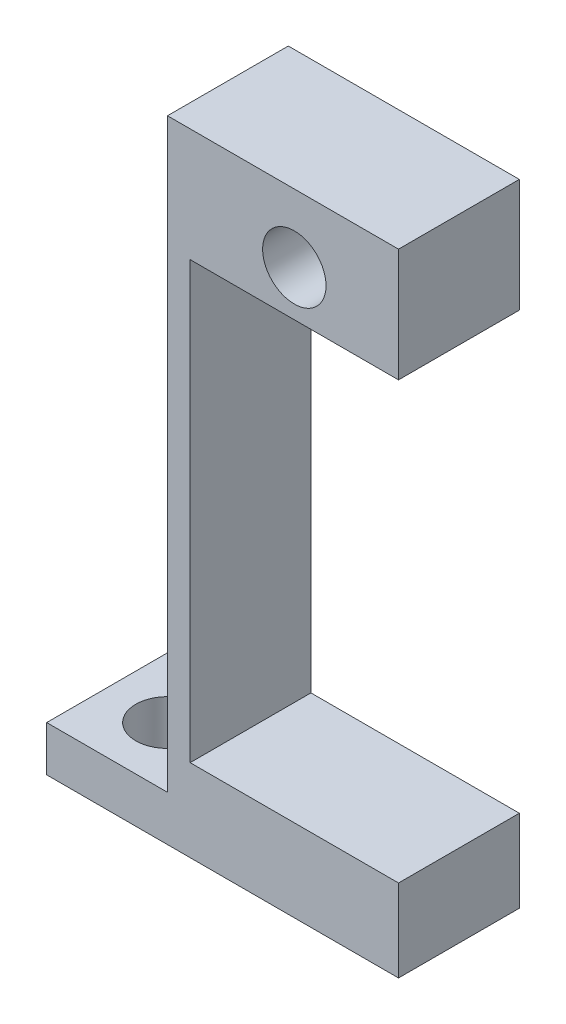
ISO-10303-21;
HEADER;
FILE_DESCRIPTION(('STEP AP214'),'2;1');
FILE_NAME('part.step','',(''),(''),'','','');
FILE_SCHEMA(('AUTOMOTIVE_DESIGN { 1 0 10303 214 1 1 1 1 }'));
ENDSEC;
DATA;
#1=APPLICATION_CONTEXT('core data for automotive mechanical design processes');
#2=APPLICATION_PROTOCOL_DEFINITION('international standard','automotive_design',2000,#1);
#3=PRODUCT_CONTEXT('',#1,'mechanical');
#4=PRODUCT('Part','Part','',(#3));
#5=PRODUCT_RELATED_PRODUCT_CATEGORY('part','',(#4));
#6=PRODUCT_DEFINITION_FORMATION('','',#4);
#7=PRODUCT_DEFINITION_CONTEXT('part definition',#1,'design');
#8=PRODUCT_DEFINITION('design','',#6,#7);
#9=PRODUCT_DEFINITION_SHAPE('','',#8);
#10=(LENGTH_UNIT() NAMED_UNIT(*) SI_UNIT(.MILLI.,.METRE.));
#11=(NAMED_UNIT(*) PLANE_ANGLE_UNIT() SI_UNIT($,.RADIAN.));
#12=(NAMED_UNIT(*) SI_UNIT($,.STERADIAN.) SOLID_ANGLE_UNIT());
#13=UNCERTAINTY_MEASURE_WITH_UNIT(LENGTH_MEASURE(1.E-05),#10,'distance_accuracy_value','');
#14=(GEOMETRIC_REPRESENTATION_CONTEXT(3) GLOBAL_UNCERTAINTY_ASSIGNED_CONTEXT((#13)) GLOBAL_UNIT_ASSIGNED_CONTEXT((#10,
#11,#12)) REPRESENTATION_CONTEXT('',''));
#15=CARTESIAN_POINT('',(0.,0.,0.));
#16=DIRECTION('',(0.,0.,1.));
#17=DIRECTION('',(1.,0.,0.));
#18=AXIS2_PLACEMENT_3D('',#15,#16,#17);
#19=CARTESIAN_POINT('',(1.5,40.3,8.));
#20=DIRECTION('',(-1.,0.,0.));
#21=DIRECTION('',(0.,0.,1.));
#22=AXIS2_PLACEMENT_3D('',#19,#20,#21);
#23=PLANE('',#22);
#24=DIRECTION('',(0.,-1.,0.));
#25=VECTOR('',#24,1.);
#26=CARTESIAN_POINT('',(1.5,40.3,8.));
#27=LINE('',#26,#25);
#28=CARTESIAN_POINT('',(1.5,32.8,8.));
#29=VERTEX_POINT('',#28);
#30=CARTESIAN_POINT('',(1.5,3.95,8.));
#31=VERTEX_POINT('',#30);
#32=EDGE_CURVE('E116',#29,#31,#27,.T.);
#33=ORIENTED_EDGE('',*,*,#32,.T.);
#34=DIRECTION('',(0.,0.,1.));
#35=VECTOR('',#34,1.);
#36=CARTESIAN_POINT('',(1.5,3.95,0.));
#37=LINE('',#36,#35);
#38=CARTESIAN_POINT('',(1.5,3.95,0.));
#39=VERTEX_POINT('',#38);
#40=EDGE_CURVE('E123',#39,#31,#37,.T.);
#41=ORIENTED_EDGE('',*,*,#40,.F.);
#42=DIRECTION('',(0.,-1.,0.));
#43=VECTOR('',#42,1.);
#44=CARTESIAN_POINT('',(1.5,40.3,0.));
#45=LINE('',#44,#43);
#46=CARTESIAN_POINT('',(1.5,32.8,0.));
#47=VERTEX_POINT('',#46);
#48=EDGE_CURVE('E136',#47,#39,#45,.T.);
#49=ORIENTED_EDGE('',*,*,#48,.F.);
#50=DIRECTION('',(0.,0.,-1.));
#51=VECTOR('',#50,1.);
#52=CARTESIAN_POINT('',(1.5,32.8,8.));
#53=LINE('',#52,#51);
#54=EDGE_CURVE('E134',#29,#47,#53,.T.);
#55=ORIENTED_EDGE('',*,*,#54,.F.);
#56=EDGE_LOOP('',(#33,#41,#49,#55));
#57=FACE_BOUND('',#56,.T.);
#58=ADVANCED_FACE('F35',(#57),#23,.F.);
#59=CARTESIAN_POINT('',(0.,1.5,0.));
#60=DIRECTION('',(0.,-1.,0.));
#61=DIRECTION('',(0.,0.,-1.));
#62=AXIS2_PLACEMENT_3D('',#59,#60,#61);
#63=PLANE('',#62);
#64=DIRECTION('',(0.,0.,-1.));
#65=VECTOR('',#64,1.);
#66=CARTESIAN_POINT('',(0.,1.5,0.));
#67=LINE('',#66,#65);
#68=CARTESIAN_POINT('',(0.,1.5,8.));
#69=VERTEX_POINT('',#68);
#70=CARTESIAN_POINT('',(0.,1.5,0.));
#71=VERTEX_POINT('',#70);
#72=EDGE_CURVE('E164',#69,#71,#67,.T.);
#73=ORIENTED_EDGE('',*,*,#72,.T.);
#74=DIRECTION('',(-1.,0.,0.));
#75=VECTOR('',#74,1.);
#76=CARTESIAN_POINT('',(0.,1.5,0.));
#77=LINE('',#76,#75);
#78=CARTESIAN_POINT('',(-8.,1.5,0.));
#79=VERTEX_POINT('',#78);
#80=EDGE_CURVE('E166',#71,#79,#77,.T.);
#81=ORIENTED_EDGE('',*,*,#80,.T.);
#82=DIRECTION('',(0.,0.,1.));
#83=VECTOR('',#82,1.);
#84=CARTESIAN_POINT('',(-8.,1.5,0.));
#85=LINE('',#84,#83);
#86=CARTESIAN_POINT('',(-8.,1.5,8.));
#87=VERTEX_POINT('',#86);
#88=EDGE_CURVE('E55',#79,#87,#85,.T.);
#89=ORIENTED_EDGE('',*,*,#88,.T.);
#90=DIRECTION('',(1.,0.,0.));
#91=VECTOR('',#90,1.);
#92=CARTESIAN_POINT('',(0.,1.5,8.));
#93=LINE('',#92,#91);
#94=EDGE_CURVE('E50',#87,#69,#93,.T.);
#95=ORIENTED_EDGE('',*,*,#94,.T.);
#96=EDGE_LOOP('',(#73,#81,#89,#95));
#97=FACE_BOUND('',#96,.T.);
#98=CARTESIAN_POINT('',(-4.,1.5,4.));
#99=DIRECTION('',(0.,1.,0.));
#100=DIRECTION('',(0.,0.,1.));
#101=AXIS2_PLACEMENT_3D('',#98,#99,#100);
#102=CIRCLE('',#101,2.1);
#103=CARTESIAN_POINT('',(-4.,1.5,6.1));
#104=VERTEX_POINT('',#103);
#105=EDGE_CURVE('E161',#104,#104,#102,.T.);
#106=ORIENTED_EDGE('',*,*,#105,.F.);
#107=EDGE_LOOP('',(#106));
#108=FACE_BOUND('',#107,.T.);
#109=ADVANCED_FACE('F221',(#97,#108),#63,.F.);
#110=CARTESIAN_POINT('',(0.,1.5,0.));
#111=DIRECTION('',(0.,0.,1.));
#112=DIRECTION('',(1.,0.,0.));
#113=AXIS2_PLACEMENT_3D('',#110,#111,#112);
#114=PLANE('',#113);
#115=CARTESIAN_POINT('',(8.4,35.8,0.));
#116=DIRECTION('',(0.,0.,1.));
#117=DIRECTION('',(1.,0.,0.));
#118=AXIS2_PLACEMENT_3D('',#115,#116,#117);
#119=CIRCLE('',#118,2.1);
#120=CARTESIAN_POINT('',(10.5,35.8,0.));
#121=VERTEX_POINT('',#120);
#122=EDGE_CURVE('E188',#121,#121,#119,.T.);
#123=ORIENTED_EDGE('',*,*,#122,.T.);
#124=EDGE_LOOP('',(#123));
#125=FACE_BOUND('',#124,.T.);
#126=ORIENTED_EDGE('',*,*,#80,.F.);
#127=DIRECTION('',(0.,-1.,0.));
#128=VECTOR('',#127,1.);
#129=CARTESIAN_POINT('',(0.,40.3,0.));
#130=LINE('',#129,#128);
#131=CARTESIAN_POINT('',(0.,40.3,0.));
#132=VERTEX_POINT('',#131);
#133=EDGE_CURVE('E140',#132,#71,#130,.T.);
#134=ORIENTED_EDGE('',*,*,#133,.F.);
#135=DIRECTION('',(-1.,0.,0.));
#136=VECTOR('',#135,1.);
#137=CARTESIAN_POINT('',(0.,40.3,0.));
#138=LINE('',#137,#136);
#139=CARTESIAN_POINT('',(15.3,40.3,0.));
#140=VERTEX_POINT('',#139);
#141=EDGE_CURVE('E213',#140,#132,#138,.T.);
#142=ORIENTED_EDGE('',*,*,#141,.F.);
#143=DIRECTION('',(0.,1.,0.));
#144=VECTOR('',#143,1.);
#145=CARTESIAN_POINT('',(15.3,40.3,0.));
#146=LINE('',#145,#144);
#147=CARTESIAN_POINT('',(15.3,32.8,0.));
#148=VERTEX_POINT('',#147);
#149=EDGE_CURVE('E196',#148,#140,#146,.T.);
#150=ORIENTED_EDGE('',*,*,#149,.F.);
#151=DIRECTION('',(-1.,0.,0.));
#152=VECTOR('',#151,1.);
#153=CARTESIAN_POINT('',(15.3,32.8,0.));
#154=LINE('',#153,#152);
#155=EDGE_CURVE('E202',#148,#47,#154,.T.);
#156=ORIENTED_EDGE('',*,*,#155,.T.);
#157=ORIENTED_EDGE('',*,*,#48,.T.);
#158=DIRECTION('',(-1.,0.,0.));
#159=VECTOR('',#158,1.);
#160=CARTESIAN_POINT('',(1.5,3.95,0.));
#161=LINE('',#160,#159);
#162=CARTESIAN_POINT('',(15.3,3.95,0.));
#163=VERTEX_POINT('',#162);
#164=EDGE_CURVE('E128',#163,#39,#161,.T.);
#165=ORIENTED_EDGE('',*,*,#164,.F.);
#166=DIRECTION('',(0.,1.,0.));
#167=VECTOR('',#166,1.);
#168=CARTESIAN_POINT('',(15.3,0.,0.));
#169=LINE('',#168,#167);
#170=CARTESIAN_POINT('',(15.3,-1.5,0.));
#171=VERTEX_POINT('',#170);
#172=EDGE_CURVE('E148',#171,#163,#169,.T.);
#173=ORIENTED_EDGE('',*,*,#172,.F.);
#174=DIRECTION('',(1.,0.,0.));
#175=VECTOR('',#174,1.);
#176=CARTESIAN_POINT('',(-8.,-1.5,0.));
#177=LINE('',#176,#175);
#178=CARTESIAN_POINT('',(-8.,-1.5,0.));
#179=VERTEX_POINT('',#178);
#180=EDGE_CURVE('E156',#179,#171,#177,.T.);
#181=ORIENTED_EDGE('',*,*,#180,.F.);
#182=DIRECTION('',(0.,-1.,0.));
#183=VECTOR('',#182,1.);
#184=CARTESIAN_POINT('',(-8.,1.5,0.));
#185=LINE('',#184,#183);
#186=EDGE_CURVE('E11',#79,#179,#185,.T.);
#187=ORIENTED_EDGE('',*,*,#186,.F.);
#188=EDGE_LOOP('',(#126,#134,#142,#150,#156,#157,#165,#173,#181,#187));
#189=FACE_BOUND('',#188,.T.);
#190=ADVANCED_FACE('F37',(#125,#189),#114,.F.);
#191=CARTESIAN_POINT('',(-8.,1.5,0.));
#192=DIRECTION('',(1.,0.,0.));
#193=DIRECTION('',(0.,0.,-1.));
#194=AXIS2_PLACEMENT_3D('',#191,#192,#193);
#195=PLANE('',#194);
#196=ORIENTED_EDGE('',*,*,#186,.T.);
#197=DIRECTION('',(0.,0.,-1.));
#198=VECTOR('',#197,1.);
#199=CARTESIAN_POINT('',(-8.,-1.5,8.));
#200=LINE('',#199,#198);
#201=CARTESIAN_POINT('',(-8.,-1.5,8.));
#202=VERTEX_POINT('',#201);
#203=EDGE_CURVE('E153',#202,#179,#200,.T.);
#204=ORIENTED_EDGE('',*,*,#203,.F.);
#205=DIRECTION('',(0.,-1.,0.));
#206=VECTOR('',#205,1.);
#207=CARTESIAN_POINT('',(-8.,1.5,8.));
#208=LINE('',#207,#206);
#209=EDGE_CURVE('E43',#87,#202,#208,.T.);
#210=ORIENTED_EDGE('',*,*,#209,.F.);
#211=ORIENTED_EDGE('',*,*,#88,.F.);
#212=EDGE_LOOP('',(#196,#204,#210,#211));
#213=FACE_BOUND('',#212,.T.);
#214=ADVANCED_FACE('F175',(#213),#195,.F.);
#215=CARTESIAN_POINT('',(0.,1.5,8.));
#216=DIRECTION('',(0.,0.,-1.));
#217=DIRECTION('',(-1.,0.,0.));
#218=AXIS2_PLACEMENT_3D('',#215,#216,#217);
#219=PLANE('',#218);
#220=CARTESIAN_POINT('',(8.4,35.8,8.));
#221=DIRECTION('',(0.,0.,1.));
#222=DIRECTION('',(1.,0.,0.));
#223=AXIS2_PLACEMENT_3D('',#220,#221,#222);
#224=CIRCLE('',#223,2.1);
#225=CARTESIAN_POINT('',(10.5,35.8,8.));
#226=VERTEX_POINT('',#225);
#227=EDGE_CURVE('E183',#226,#226,#224,.T.);
#228=ORIENTED_EDGE('',*,*,#227,.F.);
#229=EDGE_LOOP('',(#228));
#230=FACE_BOUND('',#229,.T.);
#231=ORIENTED_EDGE('',*,*,#209,.T.);
#232=DIRECTION('',(-1.,0.,0.));
#233=VECTOR('',#232,1.);
#234=CARTESIAN_POINT('',(-8.,-1.5,8.));
#235=LINE('',#234,#233);
#236=CARTESIAN_POINT('',(15.3,-1.5,8.));
#237=VERTEX_POINT('',#236);
#238=EDGE_CURVE('E158',#237,#202,#235,.T.);
#239=ORIENTED_EDGE('',*,*,#238,.F.);
#240=DIRECTION('',(0.,-1.,0.));
#241=VECTOR('',#240,1.);
#242=CARTESIAN_POINT('',(15.3,0.,8.));
#243=LINE('',#242,#241);
#244=CARTESIAN_POINT('',(15.3,3.95,8.));
#245=VERTEX_POINT('',#244);
#246=EDGE_CURVE('E118',#245,#237,#243,.T.);
#247=ORIENTED_EDGE('',*,*,#246,.F.);
#248=DIRECTION('',(1.,0.,0.));
#249=VECTOR('',#248,1.);
#250=CARTESIAN_POINT('',(1.5,3.95,8.));
#251=LINE('',#250,#249);
#252=EDGE_CURVE('E111',#31,#245,#251,.T.);
#253=ORIENTED_EDGE('',*,*,#252,.F.);
#254=ORIENTED_EDGE('',*,*,#32,.F.);
#255=DIRECTION('',(-1.,0.,0.));
#256=VECTOR('',#255,1.);
#257=CARTESIAN_POINT('',(15.3,32.8,8.));
#258=LINE('',#257,#256);
#259=CARTESIAN_POINT('',(15.3,32.8,8.));
#260=VERTEX_POINT('',#259);
#261=EDGE_CURVE('E206',#260,#29,#258,.T.);
#262=ORIENTED_EDGE('',*,*,#261,.F.);
#263=DIRECTION('',(0.,-1.,0.));
#264=VECTOR('',#263,1.);
#265=CARTESIAN_POINT('',(15.3,40.3,8.));
#266=LINE('',#265,#264);
#267=CARTESIAN_POINT('',(15.3,40.3,8.));
#268=VERTEX_POINT('',#267);
#269=EDGE_CURVE('E191',#268,#260,#266,.T.);
#270=ORIENTED_EDGE('',*,*,#269,.F.);
#271=DIRECTION('',(1.,0.,0.));
#272=VECTOR('',#271,1.);
#273=CARTESIAN_POINT('',(0.,40.3,8.));
#274=LINE('',#273,#272);
#275=CARTESIAN_POINT('',(0.,40.3,8.));
#276=VERTEX_POINT('',#275);
#277=EDGE_CURVE('E211',#276,#268,#274,.T.);
#278=ORIENTED_EDGE('',*,*,#277,.F.);
#279=DIRECTION('',(0.,-1.,0.));
#280=VECTOR('',#279,1.);
#281=CARTESIAN_POINT('',(0.,40.3,8.));
#282=LINE('',#281,#280);
#283=EDGE_CURVE('E135',#276,#69,#282,.T.);
#284=ORIENTED_EDGE('',*,*,#283,.T.);
#285=ORIENTED_EDGE('',*,*,#94,.F.);
#286=EDGE_LOOP('',(#231,#239,#247,#253,#254,#262,#270,#278,#284,#285));
#287=FACE_BOUND('',#286,.T.);
#288=ADVANCED_FACE('F113',(#230,#287),#219,.F.);
#289=CARTESIAN_POINT('',(-4.,1.5,4.));
#290=DIRECTION('',(0.,-1.,0.));
#291=DIRECTION('',(0.,0.,-1.));
#292=AXIS2_PLACEMENT_3D('',#289,#290,#291);
#293=CYLINDRICAL_SURFACE('',#292,2.1);
#294=ORIENTED_EDGE('',*,*,#105,.T.);
#295=EDGE_LOOP('',(#294));
#296=FACE_BOUND('',#295,.T.);
#297=CARTESIAN_POINT('',(-4.,-1.5,4.));
#298=DIRECTION('',(0.,-1.,0.));
#299=DIRECTION('',(0.,0.,-1.));
#300=AXIS2_PLACEMENT_3D('',#297,#298,#299);
#301=CIRCLE('',#300,2.1);
#302=CARTESIAN_POINT('',(-4.,-1.5,1.9));
#303=VERTEX_POINT('',#302);
#304=EDGE_CURVE('E150',#303,#303,#301,.T.);
#305=ORIENTED_EDGE('',*,*,#304,.T.);
#306=EDGE_LOOP('',(#305));
#307=FACE_BOUND('',#306,.T.);
#308=ADVANCED_FACE('F227',(#296,#307),#293,.F.);
#309=CARTESIAN_POINT('',(0.,-1.5,0.));
#310=DIRECTION('',(0.,-1.,0.));
#311=DIRECTION('',(0.,0.,-1.));
#312=AXIS2_PLACEMENT_3D('',#309,#310,#311);
#313=PLANE('',#312);
#314=ORIENTED_EDGE('',*,*,#203,.T.);
#315=ORIENTED_EDGE('',*,*,#180,.T.);
#316=DIRECTION('',(0.,0.,-1.));
#317=VECTOR('',#316,1.);
#318=CARTESIAN_POINT('',(15.3,-1.5,8.));
#319=LINE('',#318,#317);
#320=EDGE_CURVE('E145',#237,#171,#319,.T.);
#321=ORIENTED_EDGE('',*,*,#320,.F.);
#322=ORIENTED_EDGE('',*,*,#238,.T.);
#323=EDGE_LOOP('',(#314,#315,#321,#322));
#324=FACE_BOUND('',#323,.T.);
#325=ORIENTED_EDGE('',*,*,#304,.F.);
#326=EDGE_LOOP('',(#325));
#327=FACE_BOUND('',#326,.T.);
#328=ADVANCED_FACE('F173',(#324,#327),#313,.T.);
#329=CARTESIAN_POINT('',(15.3,0.,0.));
#330=DIRECTION('',(1.,0.,0.));
#331=DIRECTION('',(0.,0.,-1.));
#332=AXIS2_PLACEMENT_3D('',#329,#330,#331);
#333=PLANE('',#332);
#334=ORIENTED_EDGE('',*,*,#246,.T.);
#335=ORIENTED_EDGE('',*,*,#320,.T.);
#336=ORIENTED_EDGE('',*,*,#172,.T.);
#337=DIRECTION('',(0.,0.,-1.));
#338=VECTOR('',#337,1.);
#339=CARTESIAN_POINT('',(15.3,3.95,0.));
#340=LINE('',#339,#338);
#341=EDGE_CURVE('E122',#245,#163,#340,.T.);
#342=ORIENTED_EDGE('',*,*,#341,.F.);
#343=EDGE_LOOP('',(#334,#335,#336,#342));
#344=FACE_BOUND('',#343,.T.);
#345=ADVANCED_FACE('F181',(#344),#333,.T.);
#346=CARTESIAN_POINT('',(0.,40.3,8.));
#347=DIRECTION('',(1.,0.,0.));
#348=DIRECTION('',(0.,0.,-1.));
#349=AXIS2_PLACEMENT_3D('',#346,#347,#348);
#350=PLANE('',#349);
#351=ORIENTED_EDGE('',*,*,#133,.T.);
#352=ORIENTED_EDGE('',*,*,#72,.F.);
#353=ORIENTED_EDGE('',*,*,#283,.F.);
#354=DIRECTION('',(0.,0.,1.));
#355=VECTOR('',#354,1.);
#356=CARTESIAN_POINT('',(0.,40.3,8.));
#357=LINE('',#356,#355);
#358=EDGE_CURVE('E208',#132,#276,#357,.T.);
#359=ORIENTED_EDGE('',*,*,#358,.F.);
#360=EDGE_LOOP('',(#351,#352,#353,#359));
#361=FACE_BOUND('',#360,.T.);
#362=ADVANCED_FACE('F218',(#361),#350,.F.);
#363=CARTESIAN_POINT('',(0.,40.3,0.));
#364=DIRECTION('',(0.,-1.,0.));
#365=DIRECTION('',(0.,0.,-1.));
#366=AXIS2_PLACEMENT_3D('',#363,#364,#365);
#367=PLANE('',#366);
#368=ORIENTED_EDGE('',*,*,#358,.T.);
#369=ORIENTED_EDGE('',*,*,#277,.T.);
#370=DIRECTION('',(0.,0.,1.));
#371=VECTOR('',#370,1.);
#372=CARTESIAN_POINT('',(15.3,40.3,8.));
#373=LINE('',#372,#371);
#374=EDGE_CURVE('E199',#140,#268,#373,.T.);
#375=ORIENTED_EDGE('',*,*,#374,.F.);
#376=ORIENTED_EDGE('',*,*,#141,.T.);
#377=EDGE_LOOP('',(#368,#369,#375,#376));
#378=FACE_BOUND('',#377,.T.);
#379=ADVANCED_FACE('F244',(#378),#367,.F.);
#380=CARTESIAN_POINT('',(15.3,32.8,8.));
#381=DIRECTION('',(0.,1.,0.));
#382=DIRECTION('',(0.,0.,1.));
#383=AXIS2_PLACEMENT_3D('',#380,#381,#382);
#384=PLANE('',#383);
#385=ORIENTED_EDGE('',*,*,#54,.T.);
#386=ORIENTED_EDGE('',*,*,#155,.F.);
#387=DIRECTION('',(0.,0.,-1.));
#388=VECTOR('',#387,1.);
#389=CARTESIAN_POINT('',(15.3,32.8,8.));
#390=LINE('',#389,#388);
#391=EDGE_CURVE('E194',#260,#148,#390,.T.);
#392=ORIENTED_EDGE('',*,*,#391,.F.);
#393=ORIENTED_EDGE('',*,*,#261,.T.);
#394=EDGE_LOOP('',(#385,#386,#392,#393));
#395=FACE_BOUND('',#394,.T.);
#396=ADVANCED_FACE('F250',(#395),#384,.F.);
#397=CARTESIAN_POINT('',(15.3,0.,0.));
#398=DIRECTION('',(1.,0.,0.));
#399=DIRECTION('',(0.,0.,-1.));
#400=AXIS2_PLACEMENT_3D('',#397,#398,#399);
#401=PLANE('',#400);
#402=ORIENTED_EDGE('',*,*,#269,.T.);
#403=ORIENTED_EDGE('',*,*,#391,.T.);
#404=ORIENTED_EDGE('',*,*,#149,.T.);
#405=ORIENTED_EDGE('',*,*,#374,.T.);
#406=EDGE_LOOP('',(#402,#403,#404,#405));
#407=FACE_BOUND('',#406,.T.);
#408=ADVANCED_FACE('F255',(#407),#401,.T.);
#409=CARTESIAN_POINT('',(8.4,35.8,-5.8));
#410=DIRECTION('',(0.,0.,1.));
#411=DIRECTION('',(1.,0.,0.));
#412=AXIS2_PLACEMENT_3D('',#409,#410,#411);
#413=CYLINDRICAL_SURFACE('',#412,2.1);
#414=CARTESIAN_POINT('',(10.5,35.8,8.));
#415=CARTESIAN_POINT('',(10.5,35.8,7.91666666666667));
#416=CARTESIAN_POINT('',(10.5,35.8,7.83333333333333));
#417=CARTESIAN_POINT('',(10.5,35.8,7.66666666666667));
#418=CARTESIAN_POINT('',(10.5,35.8,7.58333333333333));
#419=CARTESIAN_POINT('',(10.5,35.8,7.41666666666667));
#420=CARTESIAN_POINT('',(10.5,35.8,7.33333333333333));
#421=CARTESIAN_POINT('',(10.5,35.8,7.16666666666667));
#422=CARTESIAN_POINT('',(10.5,35.8,7.08333333333333));
#423=CARTESIAN_POINT('',(10.5,35.8,6.91666666666667));
#424=CARTESIAN_POINT('',(10.5,35.8,6.83333333333333));
#425=CARTESIAN_POINT('',(10.5,35.8,6.66666666666667));
#426=CARTESIAN_POINT('',(10.5,35.8,6.58333333333333));
#427=CARTESIAN_POINT('',(10.5,35.8,6.41666666666667));
#428=CARTESIAN_POINT('',(10.5,35.8,6.33333333333333));
#429=CARTESIAN_POINT('',(10.5,35.8,6.16666666666667));
#430=CARTESIAN_POINT('',(10.5,35.8,6.08333333333333));
#431=CARTESIAN_POINT('',(10.5,35.8,5.91666666666667));
#432=CARTESIAN_POINT('',(10.5,35.8,5.83333333333333));
#433=CARTESIAN_POINT('',(10.5,35.8,5.66666666666667));
#434=CARTESIAN_POINT('',(10.5,35.8,5.58333333333333));
#435=CARTESIAN_POINT('',(10.5,35.8,5.41666666666667));
#436=CARTESIAN_POINT('',(10.5,35.8,5.33333333333333));
#437=CARTESIAN_POINT('',(10.5,35.8,5.16666666666667));
#438=CARTESIAN_POINT('',(10.5,35.8,5.08333333333333));
#439=CARTESIAN_POINT('',(10.5,35.8,4.91666666666667));
#440=CARTESIAN_POINT('',(10.5,35.8,4.83333333333333));
#441=CARTESIAN_POINT('',(10.5,35.8,4.66666666666667));
#442=CARTESIAN_POINT('',(10.5,35.8,4.58333333333333));
#443=CARTESIAN_POINT('',(10.5,35.8,4.41666666666667));
#444=CARTESIAN_POINT('',(10.5,35.8,4.33333333333333));
#445=CARTESIAN_POINT('',(10.5,35.8,4.16666666666667));
#446=CARTESIAN_POINT('',(10.5,35.8,4.08333333333333));
#447=CARTESIAN_POINT('',(10.5,35.8,3.91666666666667));
#448=CARTESIAN_POINT('',(10.5,35.8,3.83333333333333));
#449=CARTESIAN_POINT('',(10.5,35.8,3.66666666666667));
#450=CARTESIAN_POINT('',(10.5,35.8,3.58333333333333));
#451=CARTESIAN_POINT('',(10.5,35.8,3.41666666666667));
#452=CARTESIAN_POINT('',(10.5,35.8,3.33333333333333));
#453=CARTESIAN_POINT('',(10.5,35.8,3.16666666666667));
#454=CARTESIAN_POINT('',(10.5,35.8,3.08333333333333));
#455=CARTESIAN_POINT('',(10.5,35.8,2.91666666666667));
#456=CARTESIAN_POINT('',(10.5,35.8,2.83333333333333));
#457=CARTESIAN_POINT('',(10.5,35.8,2.66666666666667));
#458=CARTESIAN_POINT('',(10.5,35.8,2.58333333333333));
#459=CARTESIAN_POINT('',(10.5,35.8,2.41666666666667));
#460=CARTESIAN_POINT('',(10.5,35.8,2.33333333333333));
#461=CARTESIAN_POINT('',(10.5,35.8,2.16666666666667));
#462=CARTESIAN_POINT('',(10.5,35.8,2.08333333333333));
#463=CARTESIAN_POINT('',(10.5,35.8,1.91666666666667));
#464=CARTESIAN_POINT('',(10.5,35.8,1.83333333333333));
#465=CARTESIAN_POINT('',(10.5,35.8,1.66666666666667));
#466=CARTESIAN_POINT('',(10.5,35.8,1.58333333333333));
#467=CARTESIAN_POINT('',(10.5,35.8,1.41666666666667));
#468=CARTESIAN_POINT('',(10.5,35.8,1.33333333333333));
#469=CARTESIAN_POINT('',(10.5,35.8,1.16666666666667));
#470=CARTESIAN_POINT('',(10.5,35.8,1.08333333333333));
#471=CARTESIAN_POINT('',(10.5,35.8,0.916666666666666));
#472=CARTESIAN_POINT('',(10.5,35.8,0.833333333333332));
#473=CARTESIAN_POINT('',(10.5,35.8,0.666666666666666));
#474=CARTESIAN_POINT('',(10.5,35.8,0.583333333333333));
#475=CARTESIAN_POINT('',(10.5,35.8,0.416666666666666));
#476=CARTESIAN_POINT('',(10.5,35.8,0.333333333333333));
#477=CARTESIAN_POINT('',(10.5,35.8,0.166666666666666));
#478=CARTESIAN_POINT('',(10.5,35.8,0.0833333333333325));
#479=CARTESIAN_POINT('',(10.5,35.8,0.));
#480=B_SPLINE_CURVE_WITH_KNOTS('',3,(#414,#415,#416,#417,#418,#419,#420,#421,#422,#423,#424,
#425,#426,#427,#428,#429,#430,#431,#432,#433,#434,#435,#436,#437,#438,#439,#440,#441,#442,#443,
#444,#445,#446,#447,#448,#449,#450,#451,#452,#453,#454,#455,#456,#457,#458,#459,#460,#461,#462,
#463,#464,#465,#466,#467,#468,#469,#470,#471,#472,#473,#474,#475,#476,#477,#478,#479),
.UNSPECIFIED.,.F.,.F.,(4,2,2,2,2,2,2,2,2,2,2,2,2,2,2,2,2,2,2,2,2,2,2,2,2,2,2,2,2,2,2,2,4),(0.,
0.25,0.5,0.750000000000001,1.,1.25,1.5,1.75,2.,2.25,2.5,2.75,3.,3.25,3.5,3.75,4.,4.25,4.5,4.75,
5.,5.25,5.5,5.75,6.,6.25,6.5,6.75,7.,7.25,7.5,7.75,8.),.UNSPECIFIED.);
#481=EDGE_CURVE('BSEAM262',#226,#121,#480,.T.);
#482=ORIENTED_EDGE('',*,*,#227,.T.);
#483=ORIENTED_EDGE('',*,*,#122,.F.);
#484=ORIENTED_EDGE('',*,*,#481,.T.);
#485=ORIENTED_EDGE('',*,*,#481,.F.);
#486=EDGE_LOOP('',(#482,#484,#483,#485));
#487=FACE_BOUND('',#486,.T.);
#488=ADVANCED_FACE('F262',(#487),#413,.F.);
#489=CARTESIAN_POINT('',(0.,3.95,0.));
#490=DIRECTION('',(0.,1.,0.));
#491=DIRECTION('',(0.,0.,1.));
#492=AXIS2_PLACEMENT_3D('',#489,#490,#491);
#493=PLANE('',#492);
#494=ORIENTED_EDGE('',*,*,#40,.T.);
#495=ORIENTED_EDGE('',*,*,#252,.T.);
#496=ORIENTED_EDGE('',*,*,#341,.T.);
#497=ORIENTED_EDGE('',*,*,#164,.T.);
#498=EDGE_LOOP('',(#494,#495,#496,#497));
#499=FACE_BOUND('',#498,.T.);
#500=ADVANCED_FACE('F126',(#499),#493,.T.);
#501=CLOSED_SHELL('',(#58,#109,#190,#214,#288,#308,#328,#345,#362,#379,#396,#408,#488,#500));
#502=MANIFOLD_SOLID_BREP('B2',#501);
#503=ADVANCED_BREP_SHAPE_REPRESENTATION('',(#18,#502),#14);
#504=SHAPE_DEFINITION_REPRESENTATION(#9,#503);
ENDSEC;
END-ISO-10303-21;
